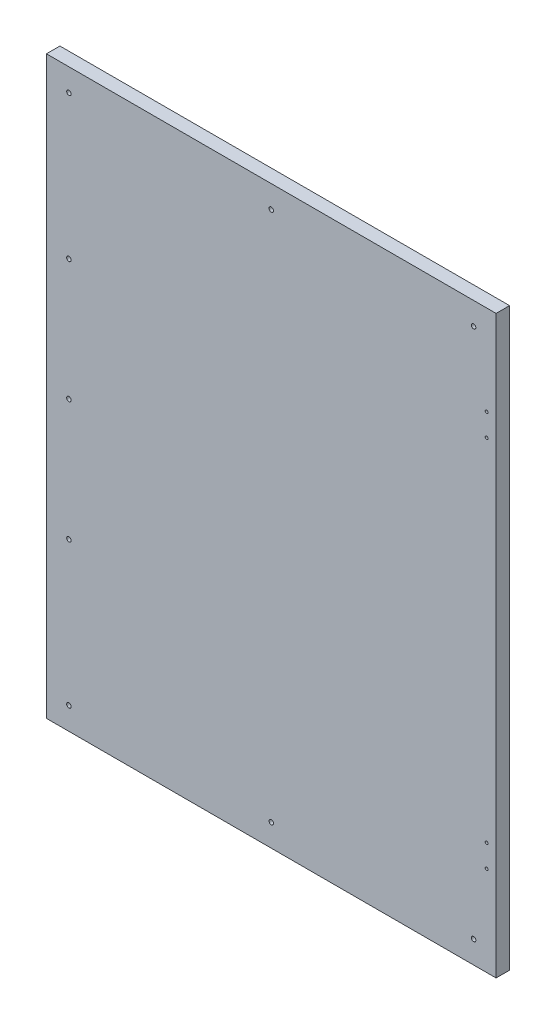
ISO-10303-21;
HEADER;
FILE_DESCRIPTION(('STEP AP214'),'2;1');
FILE_NAME('part.step','',(''),(''),'','','');
FILE_SCHEMA(('AUTOMOTIVE_DESIGN { 1 0 10303 214 1 1 1 1 }'));
ENDSEC;
DATA;
#1=APPLICATION_CONTEXT('core data for automotive mechanical design processes');
#2=APPLICATION_PROTOCOL_DEFINITION('international standard','automotive_design',2000,#1);
#3=PRODUCT_CONTEXT('',#1,'mechanical');
#4=PRODUCT('Part','Part','',(#3));
#5=PRODUCT_RELATED_PRODUCT_CATEGORY('part','',(#4));
#6=PRODUCT_DEFINITION_FORMATION('','',#4);
#7=PRODUCT_DEFINITION_CONTEXT('part definition',#1,'design');
#8=PRODUCT_DEFINITION('design','',#6,#7);
#9=PRODUCT_DEFINITION_SHAPE('','',#8);
#10=(LENGTH_UNIT() NAMED_UNIT(*) SI_UNIT(.MILLI.,.METRE.));
#11=(NAMED_UNIT(*) PLANE_ANGLE_UNIT() SI_UNIT($,.RADIAN.));
#12=(NAMED_UNIT(*) SI_UNIT($,.STERADIAN.) SOLID_ANGLE_UNIT());
#13=UNCERTAINTY_MEASURE_WITH_UNIT(LENGTH_MEASURE(1.E-05),#10,'distance_accuracy_value','');
#14=(GEOMETRIC_REPRESENTATION_CONTEXT(3) GLOBAL_UNCERTAINTY_ASSIGNED_CONTEXT((#13)) GLOBAL_UNIT_ASSIGNED_CONTEXT((#10,
#11,#12)) REPRESENTATION_CONTEXT('',''));
#15=CARTESIAN_POINT('',(0.,0.,0.));
#16=DIRECTION('',(0.,0.,1.));
#17=DIRECTION('',(1.,0.,0.));
#18=AXIS2_PLACEMENT_3D('',#15,#16,#17);
#19=CARTESIAN_POINT('',(250.,320.,15.));
#20=DIRECTION('',(-1.,0.,0.));
#21=DIRECTION('',(0.,-1.,0.));
#22=AXIS2_PLACEMENT_3D('',#19,#20,#21);
#23=PLANE('',#22);
#24=DIRECTION('',(0.,1.,0.));
#25=VECTOR('',#24,1.);
#26=CARTESIAN_POINT('',(250.,320.,0.));
#27=LINE('',#26,#25);
#28=CARTESIAN_POINT('',(250.,-320.,0.));
#29=VERTEX_POINT('',#28);
#30=CARTESIAN_POINT('',(250.,320.,0.));
#31=VERTEX_POINT('',#30);
#32=EDGE_CURVE('E100',#29,#31,#27,.T.);
#33=ORIENTED_EDGE('',*,*,#32,.T.);
#34=DIRECTION('',(0.,0.,-1.));
#35=VECTOR('',#34,1.);
#36=CARTESIAN_POINT('',(250.,320.,15.));
#37=LINE('',#36,#35);
#38=CARTESIAN_POINT('',(250.,320.,15.));
#39=VERTEX_POINT('',#38);
#40=EDGE_CURVE('E11',#39,#31,#37,.T.);
#41=ORIENTED_EDGE('',*,*,#40,.F.);
#42=DIRECTION('',(0.,1.,0.));
#43=VECTOR('',#42,1.);
#44=CARTESIAN_POINT('',(250.,320.,15.));
#45=LINE('',#44,#43);
#46=CARTESIAN_POINT('',(250.,-320.,15.));
#47=VERTEX_POINT('',#46);
#48=EDGE_CURVE('E88',#47,#39,#45,.T.);
#49=ORIENTED_EDGE('',*,*,#48,.F.);
#50=DIRECTION('',(0.,0.,-1.));
#51=VECTOR('',#50,1.);
#52=CARTESIAN_POINT('',(250.,-320.,15.));
#53=LINE('',#52,#51);
#54=EDGE_CURVE('E96',#47,#29,#53,.T.);
#55=ORIENTED_EDGE('',*,*,#54,.T.);
#56=EDGE_LOOP('',(#33,#41,#49,#55));
#57=FACE_BOUND('',#56,.T.);
#58=ADVANCED_FACE('F37',(#57),#23,.F.);
#59=CARTESIAN_POINT('',(-250.,320.,15.));
#60=DIRECTION('',(0.,-1.,0.));
#61=DIRECTION('',(0.,0.,-1.));
#62=AXIS2_PLACEMENT_3D('',#59,#60,#61);
#63=PLANE('',#62);
#64=DIRECTION('',(-1.,0.,0.));
#65=VECTOR('',#64,1.);
#66=CARTESIAN_POINT('',(-250.,320.,0.));
#67=LINE('',#66,#65);
#68=CARTESIAN_POINT('',(-250.,320.,0.));
#69=VERTEX_POINT('',#68);
#70=EDGE_CURVE('E92',#31,#69,#67,.T.);
#71=ORIENTED_EDGE('',*,*,#70,.T.);
#72=DIRECTION('',(0.,0.,-1.));
#73=VECTOR('',#72,1.);
#74=CARTESIAN_POINT('',(-250.,320.,15.));
#75=LINE('',#74,#73);
#76=CARTESIAN_POINT('',(-250.,320.,15.));
#77=VERTEX_POINT('',#76);
#78=EDGE_CURVE('E45',#77,#69,#75,.T.);
#79=ORIENTED_EDGE('',*,*,#78,.F.);
#80=DIRECTION('',(-1.,0.,0.));
#81=VECTOR('',#80,1.);
#82=CARTESIAN_POINT('',(-250.,320.,15.));
#83=LINE('',#82,#81);
#84=EDGE_CURVE('E83',#39,#77,#83,.T.);
#85=ORIENTED_EDGE('',*,*,#84,.F.);
#86=ORIENTED_EDGE('',*,*,#40,.T.);
#87=EDGE_LOOP('',(#71,#79,#85,#86));
#88=FACE_BOUND('',#87,.T.);
#89=ADVANCED_FACE('F91',(#88),#63,.F.);
#90=CARTESIAN_POINT('',(-250.,320.,15.));
#91=DIRECTION('',(1.,0.,0.));
#92=DIRECTION('',(0.,1.,0.));
#93=AXIS2_PLACEMENT_3D('',#90,#91,#92);
#94=PLANE('',#93);
#95=DIRECTION('',(0.,-1.,0.));
#96=VECTOR('',#95,1.);
#97=CARTESIAN_POINT('',(-250.,320.,0.));
#98=LINE('',#97,#96);
#99=CARTESIAN_POINT('',(-250.,-320.,0.));
#100=VERTEX_POINT('',#99);
#101=EDGE_CURVE('E70',#69,#100,#98,.T.);
#102=ORIENTED_EDGE('',*,*,#101,.T.);
#103=DIRECTION('',(0.,0.,-1.));
#104=VECTOR('',#103,1.);
#105=CARTESIAN_POINT('',(-250.,-320.,15.));
#106=LINE('',#105,#104);
#107=CARTESIAN_POINT('',(-250.,-320.,15.));
#108=VERTEX_POINT('',#107);
#109=EDGE_CURVE('E93',#108,#100,#106,.T.);
#110=ORIENTED_EDGE('',*,*,#109,.F.);
#111=DIRECTION('',(0.,-1.,0.));
#112=VECTOR('',#111,1.);
#113=CARTESIAN_POINT('',(-250.,320.,15.));
#114=LINE('',#113,#112);
#115=EDGE_CURVE('E86',#77,#108,#114,.T.);
#116=ORIENTED_EDGE('',*,*,#115,.F.);
#117=ORIENTED_EDGE('',*,*,#78,.T.);
#118=EDGE_LOOP('',(#102,#110,#116,#117));
#119=FACE_BOUND('',#118,.T.);
#120=ADVANCED_FACE('F94',(#119),#94,.F.);
#121=CARTESIAN_POINT('',(-250.,-320.,15.));
#122=DIRECTION('',(0.,1.,0.));
#123=DIRECTION('',(0.,0.,1.));
#124=AXIS2_PLACEMENT_3D('',#121,#122,#123);
#125=PLANE('',#124);
#126=DIRECTION('',(1.,0.,0.));
#127=VECTOR('',#126,1.);
#128=CARTESIAN_POINT('',(-250.,-320.,0.));
#129=LINE('',#128,#127);
#130=EDGE_CURVE('E76',#100,#29,#129,.T.);
#131=ORIENTED_EDGE('',*,*,#130,.T.);
#132=ORIENTED_EDGE('',*,*,#54,.F.);
#133=DIRECTION('',(1.,0.,0.));
#134=VECTOR('',#133,1.);
#135=CARTESIAN_POINT('',(-250.,-320.,15.));
#136=LINE('',#135,#134);
#137=EDGE_CURVE('E53',#108,#47,#136,.T.);
#138=ORIENTED_EDGE('',*,*,#137,.F.);
#139=ORIENTED_EDGE('',*,*,#109,.T.);
#140=EDGE_LOOP('',(#131,#132,#138,#139));
#141=FACE_BOUND('',#140,.T.);
#142=ADVANCED_FACE('F108',(#141),#125,.F.);
#143=CARTESIAN_POINT('',(0.,0.,15.));
#144=DIRECTION('',(0.,0.,1.));
#145=DIRECTION('',(1.,0.,0.));
#146=AXIS2_PLACEMENT_3D('',#143,#144,#145);
#147=PLANE('',#146);
#148=CARTESIAN_POINT('',(239.5,220.,15.));
#149=DIRECTION('',(0.,0.,-1.));
#150=DIRECTION('',(1.,0.,0.));
#151=AXIS2_PLACEMENT_3D('',#148,#149,#150);
#152=CIRCLE('',#151,1.59999999999999);
#153=CARTESIAN_POINT('',(241.1,220.,15.));
#154=VERTEX_POINT('',#153);
#155=EDGE_CURVE('E186',#154,#154,#152,.T.);
#156=ORIENTED_EDGE('',*,*,#155,.T.);
#157=EDGE_LOOP('',(#156));
#158=FACE_BOUND('',#157,.T.);
#159=CARTESIAN_POINT('',(239.5,195.,15.));
#160=DIRECTION('',(0.,0.,-1.));
#161=DIRECTION('',(1.,0.,0.));
#162=AXIS2_PLACEMENT_3D('',#159,#160,#161);
#163=CIRCLE('',#162,1.59999999999999);
#164=CARTESIAN_POINT('',(241.1,195.,15.));
#165=VERTEX_POINT('',#164);
#166=EDGE_CURVE('E180',#165,#165,#163,.T.);
#167=ORIENTED_EDGE('',*,*,#166,.T.);
#168=EDGE_LOOP('',(#167));
#169=FACE_BOUND('',#168,.T.);
#170=CARTESIAN_POINT('',(239.5,-220.,15.));
#171=DIRECTION('',(0.,0.,1.));
#172=DIRECTION('',(1.,0.,0.));
#173=AXIS2_PLACEMENT_3D('',#170,#171,#172);
#174=CIRCLE('',#173,1.59999999999999);
#175=CARTESIAN_POINT('',(241.1,-220.,15.));
#176=VERTEX_POINT('',#175);
#177=EDGE_CURVE('E175',#176,#176,#174,.T.);
#178=ORIENTED_EDGE('',*,*,#177,.F.);
#179=EDGE_LOOP('',(#178));
#180=FACE_BOUND('',#179,.T.);
#181=CARTESIAN_POINT('',(239.5,-195.,15.));
#182=DIRECTION('',(0.,0.,1.));
#183=DIRECTION('',(1.,0.,0.));
#184=AXIS2_PLACEMENT_3D('',#181,#182,#183);
#185=CIRCLE('',#184,1.59999999999999);
#186=CARTESIAN_POINT('',(241.1,-195.,15.));
#187=VERTEX_POINT('',#186);
#188=EDGE_CURVE('E171',#187,#187,#185,.T.);
#189=ORIENTED_EDGE('',*,*,#188,.F.);
#190=EDGE_LOOP('',(#189));
#191=FACE_BOUND('',#190,.T.);
#192=CARTESIAN_POINT('',(-225.,-295.,15.));
#193=DIRECTION('',(0.,0.,-1.));
#194=DIRECTION('',(1.,0.,0.));
#195=AXIS2_PLACEMENT_3D('',#192,#193,#194);
#196=CIRCLE('',#195,2.50000000000002);
#197=CARTESIAN_POINT('',(-222.5,-295.,15.));
#198=VERTEX_POINT('',#197);
#199=EDGE_CURVE('E163',#198,#198,#196,.T.);
#200=ORIENTED_EDGE('',*,*,#199,.T.);
#201=EDGE_LOOP('',(#200));
#202=FACE_BOUND('',#201,.T.);
#203=CARTESIAN_POINT('',(0.,-295.,15.));
#204=DIRECTION('',(0.,0.,-1.));
#205=DIRECTION('',(1.,0.,0.));
#206=AXIS2_PLACEMENT_3D('',#203,#204,#205);
#207=CIRCLE('',#206,2.5);
#208=CARTESIAN_POINT('',(2.49999999999995,-295.,15.));
#209=VERTEX_POINT('',#208);
#210=EDGE_CURVE('E157',#209,#209,#207,.T.);
#211=ORIENTED_EDGE('',*,*,#210,.T.);
#212=EDGE_LOOP('',(#211));
#213=FACE_BOUND('',#212,.T.);
#214=CARTESIAN_POINT('',(225.,-295.,15.));
#215=DIRECTION('',(0.,0.,-1.));
#216=DIRECTION('',(1.,0.,0.));
#217=AXIS2_PLACEMENT_3D('',#214,#215,#216);
#218=CIRCLE('',#217,2.50000000000002);
#219=CARTESIAN_POINT('',(227.5,-295.,15.));
#220=VERTEX_POINT('',#219);
#221=EDGE_CURVE('E150',#220,#220,#218,.T.);
#222=ORIENTED_EDGE('',*,*,#221,.T.);
#223=EDGE_LOOP('',(#222));
#224=FACE_BOUND('',#223,.T.);
#225=CARTESIAN_POINT('',(-225.,295.,15.));
#226=DIRECTION('',(0.,0.,1.));
#227=DIRECTION('',(1.,0.,0.));
#228=AXIS2_PLACEMENT_3D('',#225,#226,#227);
#229=CIRCLE('',#228,2.50000000000002);
#230=CARTESIAN_POINT('',(-222.5,295.,15.));
#231=VERTEX_POINT('',#230);
#232=EDGE_CURVE('E145',#231,#231,#229,.T.);
#233=ORIENTED_EDGE('',*,*,#232,.F.);
#234=EDGE_LOOP('',(#233));
#235=FACE_BOUND('',#234,.T.);
#236=CARTESIAN_POINT('',(0.,295.,15.));
#237=DIRECTION('',(0.,0.,1.));
#238=DIRECTION('',(1.,0.,0.));
#239=AXIS2_PLACEMENT_3D('',#236,#237,#238);
#240=CIRCLE('',#239,2.5);
#241=CARTESIAN_POINT('',(2.49999999999995,295.,15.));
#242=VERTEX_POINT('',#241);
#243=EDGE_CURVE('E142',#242,#242,#240,.T.);
#244=ORIENTED_EDGE('',*,*,#243,.F.);
#245=EDGE_LOOP('',(#244));
#246=FACE_BOUND('',#245,.T.);
#247=CARTESIAN_POINT('',(225.,295.,15.));
#248=DIRECTION('',(0.,0.,1.));
#249=DIRECTION('',(1.,0.,0.));
#250=AXIS2_PLACEMENT_3D('',#247,#248,#249);
#251=CIRCLE('',#250,2.50000000000002);
#252=CARTESIAN_POINT('',(227.5,295.,15.));
#253=VERTEX_POINT('',#252);
#254=EDGE_CURVE('E135',#253,#253,#251,.T.);
#255=ORIENTED_EDGE('',*,*,#254,.F.);
#256=EDGE_LOOP('',(#255));
#257=FACE_BOUND('',#256,.T.);
#258=CARTESIAN_POINT('',(-225.,-135.,15.));
#259=DIRECTION('',(0.,0.,1.));
#260=DIRECTION('',(1.,0.,0.));
#261=AXIS2_PLACEMENT_3D('',#258,#259,#260);
#262=CIRCLE('',#261,2.50000000000002);
#263=CARTESIAN_POINT('',(-222.5,-135.,15.));
#264=VERTEX_POINT('',#263);
#265=EDGE_CURVE('E103',#264,#264,#262,.T.);
#266=ORIENTED_EDGE('',*,*,#265,.F.);
#267=EDGE_LOOP('',(#266));
#268=FACE_BOUND('',#267,.T.);
#269=CARTESIAN_POINT('',(-225.,0.,15.));
#270=DIRECTION('',(0.,0.,1.));
#271=DIRECTION('',(1.,0.,0.));
#272=AXIS2_PLACEMENT_3D('',#269,#270,#271);
#273=CIRCLE('',#272,2.50000000000002);
#274=CARTESIAN_POINT('',(-222.5,0.,15.));
#275=VERTEX_POINT('',#274);
#276=EDGE_CURVE('E116',#275,#275,#273,.T.);
#277=ORIENTED_EDGE('',*,*,#276,.F.);
#278=EDGE_LOOP('',(#277));
#279=FACE_BOUND('',#278,.T.);
#280=CARTESIAN_POINT('',(-225.,135.,15.));
#281=DIRECTION('',(0.,0.,1.));
#282=DIRECTION('',(1.,0.,0.));
#283=AXIS2_PLACEMENT_3D('',#280,#281,#282);
#284=CIRCLE('',#283,2.50000000000002);
#285=CARTESIAN_POINT('',(-222.5,135.,15.));
#286=VERTEX_POINT('',#285);
#287=EDGE_CURVE('E119',#286,#286,#284,.T.);
#288=ORIENTED_EDGE('',*,*,#287,.F.);
#289=EDGE_LOOP('',(#288));
#290=FACE_BOUND('',#289,.T.);
#291=ORIENTED_EDGE('',*,*,#48,.T.);
#292=ORIENTED_EDGE('',*,*,#84,.T.);
#293=ORIENTED_EDGE('',*,*,#115,.T.);
#294=ORIENTED_EDGE('',*,*,#137,.T.);
#295=EDGE_LOOP('',(#291,#292,#293,#294));
#296=FACE_BOUND('',#295,.T.);
#297=ADVANCED_FACE('F84',(#158,#169,#180,#191,#202,#213,#224,#235,#246,#257,#268,#279,#290,
#296),#147,.T.);
#298=CARTESIAN_POINT('',(0.,0.,0.));
#299=DIRECTION('',(0.,0.,1.));
#300=DIRECTION('',(1.,0.,0.));
#301=AXIS2_PLACEMENT_3D('',#298,#299,#300);
#302=PLANE('',#301);
#303=CARTESIAN_POINT('',(239.5,220.,0.));
#304=DIRECTION('',(0.,0.,-1.));
#305=DIRECTION('',(1.,0.,0.));
#306=AXIS2_PLACEMENT_3D('',#303,#304,#305);
#307=CIRCLE('',#306,1.59999999999999);
#308=CARTESIAN_POINT('',(241.1,220.,0.));
#309=VERTEX_POINT('',#308);
#310=EDGE_CURVE('E172',#309,#309,#307,.T.);
#311=ORIENTED_EDGE('',*,*,#310,.F.);
#312=EDGE_LOOP('',(#311));
#313=FACE_BOUND('',#312,.T.);
#314=CARTESIAN_POINT('',(239.5,195.,0.));
#315=DIRECTION('',(0.,0.,-1.));
#316=DIRECTION('',(1.,0.,0.));
#317=AXIS2_PLACEMENT_3D('',#314,#315,#316);
#318=CIRCLE('',#317,1.59999999999999);
#319=CARTESIAN_POINT('',(241.1,195.,0.));
#320=VERTEX_POINT('',#319);
#321=EDGE_CURVE('E183',#320,#320,#318,.T.);
#322=ORIENTED_EDGE('',*,*,#321,.F.);
#323=EDGE_LOOP('',(#322));
#324=FACE_BOUND('',#323,.T.);
#325=CARTESIAN_POINT('',(239.5,-220.,0.));
#326=DIRECTION('',(0.,0.,1.));
#327=DIRECTION('',(1.,0.,0.));
#328=AXIS2_PLACEMENT_3D('',#325,#326,#327);
#329=CIRCLE('',#328,1.59999999999999);
#330=CARTESIAN_POINT('',(241.1,-220.,0.));
#331=VERTEX_POINT('',#330);
#332=EDGE_CURVE('E154',#331,#331,#329,.T.);
#333=ORIENTED_EDGE('',*,*,#332,.T.);
#334=EDGE_LOOP('',(#333));
#335=FACE_BOUND('',#334,.T.);
#336=CARTESIAN_POINT('',(239.5,-195.,0.));
#337=DIRECTION('',(0.,0.,1.));
#338=DIRECTION('',(1.,0.,0.));
#339=AXIS2_PLACEMENT_3D('',#336,#337,#338);
#340=CIRCLE('',#339,1.59999999999999);
#341=CARTESIAN_POINT('',(241.1,-195.,0.));
#342=VERTEX_POINT('',#341);
#343=EDGE_CURVE('E168',#342,#342,#340,.T.);
#344=ORIENTED_EDGE('',*,*,#343,.T.);
#345=EDGE_LOOP('',(#344));
#346=FACE_BOUND('',#345,.T.);
#347=CARTESIAN_POINT('',(-225.,-295.,0.));
#348=DIRECTION('',(0.,0.,-1.));
#349=DIRECTION('',(1.,0.,0.));
#350=AXIS2_PLACEMENT_3D('',#347,#348,#349);
#351=CIRCLE('',#350,2.50000000000002);
#352=CARTESIAN_POINT('',(-222.5,-295.,0.));
#353=VERTEX_POINT('',#352);
#354=EDGE_CURVE('E136',#353,#353,#351,.T.);
#355=ORIENTED_EDGE('',*,*,#354,.F.);
#356=EDGE_LOOP('',(#355));
#357=FACE_BOUND('',#356,.T.);
#358=CARTESIAN_POINT('',(0.,-295.,0.));
#359=DIRECTION('',(0.,0.,-1.));
#360=DIRECTION('',(1.,0.,0.));
#361=AXIS2_PLACEMENT_3D('',#358,#359,#360);
#362=CIRCLE('',#361,2.5);
#363=CARTESIAN_POINT('',(2.49999999999995,-295.,0.));
#364=VERTEX_POINT('',#363);
#365=EDGE_CURVE('E160',#364,#364,#362,.T.);
#366=ORIENTED_EDGE('',*,*,#365,.F.);
#367=EDGE_LOOP('',(#366));
#368=FACE_BOUND('',#367,.T.);
#369=CARTESIAN_POINT('',(225.,-295.,0.));
#370=DIRECTION('',(0.,0.,-1.));
#371=DIRECTION('',(1.,0.,0.));
#372=AXIS2_PLACEMENT_3D('',#369,#370,#371);
#373=CIRCLE('',#372,2.50000000000002);
#374=CARTESIAN_POINT('',(227.5,-295.,0.));
#375=VERTEX_POINT('',#374);
#376=EDGE_CURVE('E153',#375,#375,#373,.T.);
#377=ORIENTED_EDGE('',*,*,#376,.F.);
#378=EDGE_LOOP('',(#377));
#379=FACE_BOUND('',#378,.T.);
#380=CARTESIAN_POINT('',(-225.,295.,0.));
#381=DIRECTION('',(0.,0.,1.));
#382=DIRECTION('',(1.,0.,0.));
#383=AXIS2_PLACEMENT_3D('',#380,#381,#382);
#384=CIRCLE('',#383,2.50000000000002);
#385=CARTESIAN_POINT('',(-222.5,295.,0.));
#386=VERTEX_POINT('',#385);
#387=EDGE_CURVE('E127',#386,#386,#384,.T.);
#388=ORIENTED_EDGE('',*,*,#387,.T.);
#389=EDGE_LOOP('',(#388));
#390=FACE_BOUND('',#389,.T.);
#391=CARTESIAN_POINT('',(0.,295.,0.));
#392=DIRECTION('',(0.,0.,1.));
#393=DIRECTION('',(1.,0.,0.));
#394=AXIS2_PLACEMENT_3D('',#391,#392,#393);
#395=CIRCLE('',#394,2.5);
#396=CARTESIAN_POINT('',(2.49999999999995,295.,0.));
#397=VERTEX_POINT('',#396);
#398=EDGE_CURVE('E139',#397,#397,#395,.T.);
#399=ORIENTED_EDGE('',*,*,#398,.T.);
#400=EDGE_LOOP('',(#399));
#401=FACE_BOUND('',#400,.T.);
#402=CARTESIAN_POINT('',(225.,295.,0.));
#403=DIRECTION('',(0.,0.,1.));
#404=DIRECTION('',(1.,0.,0.));
#405=AXIS2_PLACEMENT_3D('',#402,#403,#404);
#406=CIRCLE('',#405,2.50000000000002);
#407=CARTESIAN_POINT('',(227.5,295.,0.));
#408=VERTEX_POINT('',#407);
#409=EDGE_CURVE('E132',#408,#408,#406,.T.);
#410=ORIENTED_EDGE('',*,*,#409,.T.);
#411=EDGE_LOOP('',(#410));
#412=FACE_BOUND('',#411,.T.);
#413=CARTESIAN_POINT('',(-225.,-135.,0.));
#414=DIRECTION('',(0.,0.,1.));
#415=DIRECTION('',(1.,0.,0.));
#416=AXIS2_PLACEMENT_3D('',#413,#414,#415);
#417=CIRCLE('',#416,2.50000000000002);
#418=CARTESIAN_POINT('',(-222.5,-135.,0.));
#419=VERTEX_POINT('',#418);
#420=EDGE_CURVE('E122',#419,#419,#417,.T.);
#421=ORIENTED_EDGE('',*,*,#420,.T.);
#422=EDGE_LOOP('',(#421));
#423=FACE_BOUND('',#422,.T.);
#424=CARTESIAN_POINT('',(-225.,0.,0.));
#425=DIRECTION('',(0.,0.,1.));
#426=DIRECTION('',(1.,0.,0.));
#427=AXIS2_PLACEMENT_3D('',#424,#425,#426);
#428=CIRCLE('',#427,2.50000000000002);
#429=CARTESIAN_POINT('',(-222.5,0.,0.));
#430=VERTEX_POINT('',#429);
#431=EDGE_CURVE('E126',#430,#430,#428,.T.);
#432=ORIENTED_EDGE('',*,*,#431,.T.);
#433=EDGE_LOOP('',(#432));
#434=FACE_BOUND('',#433,.T.);
#435=CARTESIAN_POINT('',(-225.,135.,0.));
#436=DIRECTION('',(0.,0.,1.));
#437=DIRECTION('',(1.,0.,0.));
#438=AXIS2_PLACEMENT_3D('',#435,#436,#437);
#439=CIRCLE('',#438,2.50000000000002);
#440=CARTESIAN_POINT('',(-222.5,135.,0.));
#441=VERTEX_POINT('',#440);
#442=EDGE_CURVE('E123',#441,#441,#439,.T.);
#443=ORIENTED_EDGE('',*,*,#442,.T.);
#444=EDGE_LOOP('',(#443));
#445=FACE_BOUND('',#444,.T.);
#446=ORIENTED_EDGE('',*,*,#32,.F.);
#447=ORIENTED_EDGE('',*,*,#130,.F.);
#448=ORIENTED_EDGE('',*,*,#101,.F.);
#449=ORIENTED_EDGE('',*,*,#70,.F.);
#450=EDGE_LOOP('',(#446,#447,#448,#449));
#451=FACE_BOUND('',#450,.T.);
#452=ADVANCED_FACE('F111',(#313,#324,#335,#346,#357,#368,#379,#390,#401,#412,#423,#434,#445,
#451),#302,.F.);
#453=CARTESIAN_POINT('',(-225.,135.,0.));
#454=DIRECTION('',(0.,0.,1.));
#455=DIRECTION('',(1.,0.,0.));
#456=AXIS2_PLACEMENT_3D('',#453,#454,#455);
#457=CYLINDRICAL_SURFACE('',#456,2.50000000000002);
#458=ORIENTED_EDGE('',*,*,#287,.T.);
#459=EDGE_LOOP('',(#458));
#460=FACE_BOUND('',#459,.T.);
#461=ORIENTED_EDGE('',*,*,#442,.F.);
#462=EDGE_LOOP('',(#461));
#463=FACE_BOUND('',#462,.T.);
#464=ADVANCED_FACE('F197',(#460,#463),#457,.F.);
#465=CARTESIAN_POINT('',(-225.,0.,0.));
#466=DIRECTION('',(0.,0.,1.));
#467=DIRECTION('',(1.,0.,0.));
#468=AXIS2_PLACEMENT_3D('',#465,#466,#467);
#469=CYLINDRICAL_SURFACE('',#468,2.50000000000002);
#470=ORIENTED_EDGE('',*,*,#276,.T.);
#471=EDGE_LOOP('',(#470));
#472=FACE_BOUND('',#471,.T.);
#473=ORIENTED_EDGE('',*,*,#431,.F.);
#474=EDGE_LOOP('',(#473));
#475=FACE_BOUND('',#474,.T.);
#476=ADVANCED_FACE('F224',(#472,#475),#469,.F.);
#477=CARTESIAN_POINT('',(-225.,-135.,0.));
#478=DIRECTION('',(0.,0.,1.));
#479=DIRECTION('',(1.,0.,0.));
#480=AXIS2_PLACEMENT_3D('',#477,#478,#479);
#481=CYLINDRICAL_SURFACE('',#480,2.50000000000002);
#482=ORIENTED_EDGE('',*,*,#265,.T.);
#483=EDGE_LOOP('',(#482));
#484=FACE_BOUND('',#483,.T.);
#485=ORIENTED_EDGE('',*,*,#420,.F.);
#486=EDGE_LOOP('',(#485));
#487=FACE_BOUND('',#486,.T.);
#488=ADVANCED_FACE('F231',(#484,#487),#481,.F.);
#489=CARTESIAN_POINT('',(225.,295.,0.));
#490=DIRECTION('',(0.,0.,1.));
#491=DIRECTION('',(1.,0.,0.));
#492=AXIS2_PLACEMENT_3D('',#489,#490,#491);
#493=CYLINDRICAL_SURFACE('',#492,2.50000000000002);
#494=ORIENTED_EDGE('',*,*,#409,.F.);
#495=EDGE_LOOP('',(#494));
#496=FACE_BOUND('',#495,.T.);
#497=ORIENTED_EDGE('',*,*,#254,.T.);
#498=EDGE_LOOP('',(#497));
#499=FACE_BOUND('',#498,.T.);
#500=ADVANCED_FACE('F279',(#496,#499),#493,.F.);
#501=CARTESIAN_POINT('',(0.,295.,0.));
#502=DIRECTION('',(0.,0.,1.));
#503=DIRECTION('',(1.,0.,0.));
#504=AXIS2_PLACEMENT_3D('',#501,#502,#503);
#505=CYLINDRICAL_SURFACE('',#504,2.5);
#506=ORIENTED_EDGE('',*,*,#398,.F.);
#507=EDGE_LOOP('',(#506));
#508=FACE_BOUND('',#507,.T.);
#509=ORIENTED_EDGE('',*,*,#243,.T.);
#510=EDGE_LOOP('',(#509));
#511=FACE_BOUND('',#510,.T.);
#512=ADVANCED_FACE('F284',(#508,#511),#505,.F.);
#513=CARTESIAN_POINT('',(-225.,295.,0.));
#514=DIRECTION('',(0.,0.,1.));
#515=DIRECTION('',(1.,0.,0.));
#516=AXIS2_PLACEMENT_3D('',#513,#514,#515);
#517=CYLINDRICAL_SURFACE('',#516,2.50000000000002);
#518=ORIENTED_EDGE('',*,*,#387,.F.);
#519=EDGE_LOOP('',(#518));
#520=FACE_BOUND('',#519,.T.);
#521=ORIENTED_EDGE('',*,*,#232,.T.);
#522=EDGE_LOOP('',(#521));
#523=FACE_BOUND('',#522,.T.);
#524=ADVANCED_FACE('F290',(#520,#523),#517,.F.);
#525=CARTESIAN_POINT('',(225.,-295.,0.));
#526=DIRECTION('',(0.,0.,1.));
#527=DIRECTION('',(1.,0.,0.));
#528=AXIS2_PLACEMENT_3D('',#525,#526,#527);
#529=CYLINDRICAL_SURFACE('',#528,2.50000000000002);
#530=ORIENTED_EDGE('',*,*,#376,.T.);
#531=EDGE_LOOP('',(#530));
#532=FACE_BOUND('',#531,.T.);
#533=ORIENTED_EDGE('',*,*,#221,.F.);
#534=EDGE_LOOP('',(#533));
#535=FACE_BOUND('',#534,.T.);
#536=ADVANCED_FACE('F294',(#532,#535),#529,.F.);
#537=CARTESIAN_POINT('',(0.,-295.,0.));
#538=DIRECTION('',(0.,0.,1.));
#539=DIRECTION('',(1.,0.,0.));
#540=AXIS2_PLACEMENT_3D('',#537,#538,#539);
#541=CYLINDRICAL_SURFACE('',#540,2.5);
#542=ORIENTED_EDGE('',*,*,#365,.T.);
#543=EDGE_LOOP('',(#542));
#544=FACE_BOUND('',#543,.T.);
#545=ORIENTED_EDGE('',*,*,#210,.F.);
#546=EDGE_LOOP('',(#545));
#547=FACE_BOUND('',#546,.T.);
#548=ADVANCED_FACE('F298',(#544,#547),#541,.F.);
#549=CARTESIAN_POINT('',(-225.,-295.,0.));
#550=DIRECTION('',(0.,0.,1.));
#551=DIRECTION('',(1.,0.,0.));
#552=AXIS2_PLACEMENT_3D('',#549,#550,#551);
#553=CYLINDRICAL_SURFACE('',#552,2.50000000000002);
#554=ORIENTED_EDGE('',*,*,#354,.T.);
#555=EDGE_LOOP('',(#554));
#556=FACE_BOUND('',#555,.T.);
#557=ORIENTED_EDGE('',*,*,#199,.F.);
#558=EDGE_LOOP('',(#557));
#559=FACE_BOUND('',#558,.T.);
#560=ADVANCED_FACE('F302',(#556,#559),#553,.F.);
#561=CARTESIAN_POINT('',(239.5,-195.,0.));
#562=DIRECTION('',(0.,0.,1.));
#563=DIRECTION('',(1.,0.,0.));
#564=AXIS2_PLACEMENT_3D('',#561,#562,#563);
#565=CYLINDRICAL_SURFACE('',#564,1.59999999999999);
#566=ORIENTED_EDGE('',*,*,#343,.F.);
#567=EDGE_LOOP('',(#566));
#568=FACE_BOUND('',#567,.T.);
#569=ORIENTED_EDGE('',*,*,#188,.T.);
#570=EDGE_LOOP('',(#569));
#571=FACE_BOUND('',#570,.T.);
#572=ADVANCED_FACE('F306',(#568,#571),#565,.F.);
#573=CARTESIAN_POINT('',(239.5,-220.,0.));
#574=DIRECTION('',(0.,0.,1.));
#575=DIRECTION('',(1.,0.,0.));
#576=AXIS2_PLACEMENT_3D('',#573,#574,#575);
#577=CYLINDRICAL_SURFACE('',#576,1.59999999999999);
#578=ORIENTED_EDGE('',*,*,#332,.F.);
#579=EDGE_LOOP('',(#578));
#580=FACE_BOUND('',#579,.T.);
#581=ORIENTED_EDGE('',*,*,#177,.T.);
#582=EDGE_LOOP('',(#581));
#583=FACE_BOUND('',#582,.T.);
#584=ADVANCED_FACE('F310',(#580,#583),#577,.F.);
#585=CARTESIAN_POINT('',(239.5,195.,0.));
#586=DIRECTION('',(0.,0.,1.));
#587=DIRECTION('',(1.,0.,0.));
#588=AXIS2_PLACEMENT_3D('',#585,#586,#587);
#589=CYLINDRICAL_SURFACE('',#588,1.59999999999999);
#590=ORIENTED_EDGE('',*,*,#321,.T.);
#591=EDGE_LOOP('',(#590));
#592=FACE_BOUND('',#591,.T.);
#593=ORIENTED_EDGE('',*,*,#166,.F.);
#594=EDGE_LOOP('',(#593));
#595=FACE_BOUND('',#594,.T.);
#596=ADVANCED_FACE('F314',(#592,#595),#589,.F.);
#597=CARTESIAN_POINT('',(239.5,220.,0.));
#598=DIRECTION('',(0.,0.,1.));
#599=DIRECTION('',(1.,0.,0.));
#600=AXIS2_PLACEMENT_3D('',#597,#598,#599);
#601=CYLINDRICAL_SURFACE('',#600,1.59999999999999);
#602=ORIENTED_EDGE('',*,*,#310,.T.);
#603=EDGE_LOOP('',(#602));
#604=FACE_BOUND('',#603,.T.);
#605=ORIENTED_EDGE('',*,*,#155,.F.);
#606=EDGE_LOOP('',(#605));
#607=FACE_BOUND('',#606,.T.);
#608=ADVANCED_FACE('F192',(#604,#607),#601,.F.);
#609=CLOSED_SHELL('',(#58,#89,#120,#142,#297,#452,#464,#476,#488,#500,#512,#524,#536,#548,#560,
#572,#584,#596,#608));
#610=MANIFOLD_SOLID_BREP('B2',#609);
#611=ADVANCED_BREP_SHAPE_REPRESENTATION('',(#18,#610),#14);
#612=SHAPE_DEFINITION_REPRESENTATION(#9,#611);
ENDSEC;
END-ISO-10303-21;
